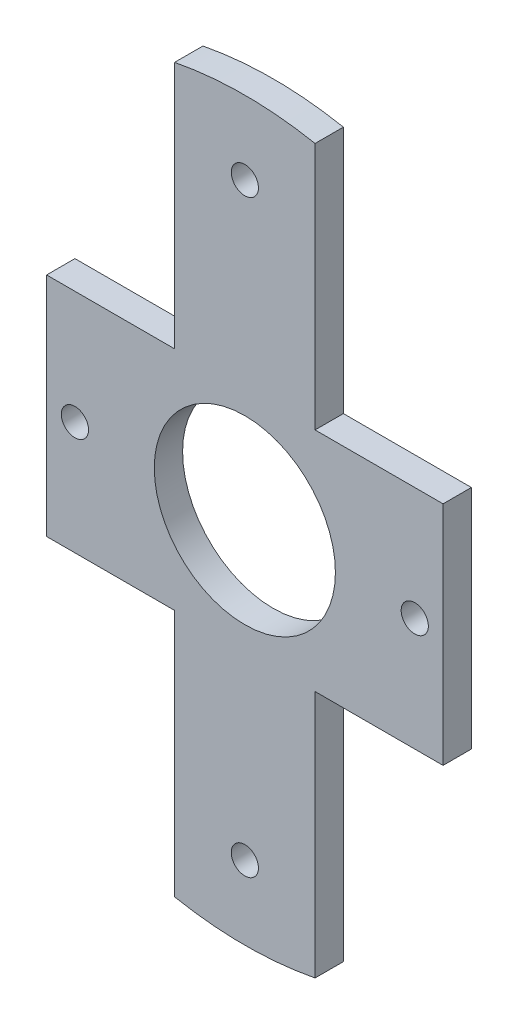
ISO-10303-21;
HEADER;
FILE_DESCRIPTION(('STEP AP214'),'2;1');
FILE_NAME('part.step','',(''),(''),'','','');
FILE_SCHEMA(('AUTOMOTIVE_DESIGN { 1 0 10303 214 1 1 1 1 }'));
ENDSEC;
DATA;
#1=APPLICATION_CONTEXT('core data for automotive mechanical design processes');
#2=APPLICATION_PROTOCOL_DEFINITION('international standard','automotive_design',2000,#1);
#3=PRODUCT_CONTEXT('',#1,'mechanical');
#4=PRODUCT('Part','Part','',(#3));
#5=PRODUCT_RELATED_PRODUCT_CATEGORY('part','',(#4));
#6=PRODUCT_DEFINITION_FORMATION('','',#4);
#7=PRODUCT_DEFINITION_CONTEXT('part definition',#1,'design');
#8=PRODUCT_DEFINITION('design','',#6,#7);
#9=PRODUCT_DEFINITION_SHAPE('','',#8);
#10=(LENGTH_UNIT() NAMED_UNIT(*) SI_UNIT(.MILLI.,.METRE.));
#11=(NAMED_UNIT(*) PLANE_ANGLE_UNIT() SI_UNIT($,.RADIAN.));
#12=(NAMED_UNIT(*) SI_UNIT($,.STERADIAN.) SOLID_ANGLE_UNIT());
#13=UNCERTAINTY_MEASURE_WITH_UNIT(LENGTH_MEASURE(1.E-05),#10,'distance_accuracy_value','');
#14=(GEOMETRIC_REPRESENTATION_CONTEXT(3) GLOBAL_UNCERTAINTY_ASSIGNED_CONTEXT((#13)) GLOBAL_UNIT_ASSIGNED_CONTEXT((#10,
#11,#12)) REPRESENTATION_CONTEXT('',''));
#15=CARTESIAN_POINT('',(0.,0.,0.));
#16=DIRECTION('',(0.,0.,1.));
#17=DIRECTION('',(1.,0.,0.));
#18=AXIS2_PLACEMENT_3D('',#15,#16,#17);
#19=CARTESIAN_POINT('',(0.,0.,5.));
#20=DIRECTION('',(0.,0.,1.));
#21=DIRECTION('',(1.,0.,0.));
#22=AXIS2_PLACEMENT_3D('',#19,#20,#21);
#23=PLANE('',#22);
#24=CARTESIAN_POINT('',(0.,-52.,5.));
#25=DIRECTION('',(0.,0.,1.));
#26=DIRECTION('',(-1.,0.,0.));
#27=AXIS2_PLACEMENT_3D('',#24,#25,#26);
#28=CIRCLE('',#27,2.4);
#29=CARTESIAN_POINT('',(-2.4,-52.,5.));
#30=VERTEX_POINT('',#29);
#31=EDGE_CURVE('E299',#30,#30,#28,.T.);
#32=ORIENTED_EDGE('',*,*,#31,.F.);
#33=EDGE_LOOP('',(#32));
#34=FACE_BOUND('',#33,.T.);
#35=CARTESIAN_POINT('',(0.,52.,5.));
#36=DIRECTION('',(0.,0.,1.));
#37=DIRECTION('',(1.,0.,0.));
#38=AXIS2_PLACEMENT_3D('',#35,#36,#37);
#39=CIRCLE('',#38,2.4);
#40=CARTESIAN_POINT('',(2.4,52.,5.));
#41=VERTEX_POINT('',#40);
#42=EDGE_CURVE('E311',#41,#41,#39,.T.);
#43=ORIENTED_EDGE('',*,*,#42,.F.);
#44=EDGE_LOOP('',(#43));
#45=FACE_BOUND('',#44,.T.);
#46=DIRECTION('',(0.,1.,0.));
#47=VECTOR('',#46,1.);
#48=CARTESIAN_POINT('',(12.4,20.,5.));
#49=LINE('',#48,#47);
#50=CARTESIAN_POINT('',(12.4,20.,5.));
#51=VERTEX_POINT('',#50);
#52=CARTESIAN_POINT('',(12.4,63.806269284452,5.));
#53=VERTEX_POINT('',#52);
#54=EDGE_CURVE('E181',#51,#53,#49,.T.);
#55=ORIENTED_EDGE('',*,*,#54,.T.);
#56=CARTESIAN_POINT('',(0.,0.,5.));
#57=DIRECTION('',(0.,0.,1.));
#58=DIRECTION('',(1.,0.,0.));
#59=AXIS2_PLACEMENT_3D('',#56,#57,#58);
#60=CIRCLE('',#59,65.);
#61=CARTESIAN_POINT('',(-12.4,63.806269284452,5.));
#62=VERTEX_POINT('',#61);
#63=EDGE_CURVE('E108',#53,#62,#60,.T.);
#64=ORIENTED_EDGE('',*,*,#63,.T.);
#65=DIRECTION('',(0.,-1.,0.));
#66=VECTOR('',#65,1.);
#67=CARTESIAN_POINT('',(-12.4,20.,5.));
#68=LINE('',#67,#66);
#69=CARTESIAN_POINT('',(-12.4,20.,5.));
#70=VERTEX_POINT('',#69);
#71=EDGE_CURVE('E208',#62,#70,#68,.T.);
#72=ORIENTED_EDGE('',*,*,#71,.T.);
#73=DIRECTION('',(-1.,0.,0.));
#74=VECTOR('',#73,1.);
#75=CARTESIAN_POINT('',(-12.4,20.,5.));
#76=LINE('',#75,#74);
#77=CARTESIAN_POINT('',(-35.,20.,5.));
#78=VERTEX_POINT('',#77);
#79=EDGE_CURVE('E227',#70,#78,#76,.T.);
#80=ORIENTED_EDGE('',*,*,#79,.T.);
#81=DIRECTION('',(0.,-1.,0.));
#82=VECTOR('',#81,1.);
#83=CARTESIAN_POINT('',(-35.,20.,5.));
#84=LINE('',#83,#82);
#85=CARTESIAN_POINT('',(-35.,-20.,5.));
#86=VERTEX_POINT('',#85);
#87=EDGE_CURVE('E224',#78,#86,#84,.T.);
#88=ORIENTED_EDGE('',*,*,#87,.T.);
#89=DIRECTION('',(1.,0.,0.));
#90=VECTOR('',#89,1.);
#91=CARTESIAN_POINT('',(-12.4,-20.,5.));
#92=LINE('',#91,#90);
#93=CARTESIAN_POINT('',(-12.4,-20.,5.));
#94=VERTEX_POINT('',#93);
#95=EDGE_CURVE('E226',#86,#94,#92,.T.);
#96=ORIENTED_EDGE('',*,*,#95,.T.);
#97=DIRECTION('',(0.,-1.,0.));
#98=VECTOR('',#97,1.);
#99=CARTESIAN_POINT('',(-12.4,-20.,5.));
#100=LINE('',#99,#98);
#101=CARTESIAN_POINT('',(-12.4,-63.806269284452,5.));
#102=VERTEX_POINT('',#101);
#103=EDGE_CURVE('E229',#94,#102,#100,.T.);
#104=ORIENTED_EDGE('',*,*,#103,.T.);
#105=CARTESIAN_POINT('',(0.,0.,5.));
#106=DIRECTION('',(0.,0.,1.));
#107=DIRECTION('',(1.,0.,0.));
#108=AXIS2_PLACEMENT_3D('',#105,#106,#107);
#109=CIRCLE('',#108,65.);
#110=CARTESIAN_POINT('',(12.4,-63.806269284452,5.));
#111=VERTEX_POINT('',#110);
#112=EDGE_CURVE('E235',#102,#111,#109,.T.);
#113=ORIENTED_EDGE('',*,*,#112,.T.);
#114=DIRECTION('',(0.,1.,0.));
#115=VECTOR('',#114,1.);
#116=CARTESIAN_POINT('',(12.4,-20.,5.));
#117=LINE('',#116,#115);
#118=CARTESIAN_POINT('',(12.4,-20.,5.));
#119=VERTEX_POINT('',#118);
#120=EDGE_CURVE('E139',#111,#119,#117,.T.);
#121=ORIENTED_EDGE('',*,*,#120,.T.);
#122=DIRECTION('',(1.,0.,0.));
#123=VECTOR('',#122,1.);
#124=CARTESIAN_POINT('',(12.4,-20.,5.));
#125=LINE('',#124,#123);
#126=CARTESIAN_POINT('',(35.,-20.,5.));
#127=VERTEX_POINT('',#126);
#128=EDGE_CURVE('E133',#119,#127,#125,.T.);
#129=ORIENTED_EDGE('',*,*,#128,.T.);
#130=DIRECTION('',(0.,1.,0.));
#131=VECTOR('',#130,1.);
#132=CARTESIAN_POINT('',(35.,-20.,5.));
#133=LINE('',#132,#131);
#134=CARTESIAN_POINT('',(35.,20.,5.));
#135=VERTEX_POINT('',#134);
#136=EDGE_CURVE('E137',#127,#135,#133,.T.);
#137=ORIENTED_EDGE('',*,*,#136,.T.);
#138=DIRECTION('',(-1.,0.,0.));
#139=VECTOR('',#138,1.);
#140=CARTESIAN_POINT('',(12.4,20.,5.));
#141=LINE('',#140,#139);
#142=EDGE_CURVE('E54',#135,#51,#141,.T.);
#143=ORIENTED_EDGE('',*,*,#142,.T.);
#144=EDGE_LOOP('',(#55,#64,#72,#80,#88,#96,#104,#113,#121,#129,#137,#143));
#145=FACE_BOUND('',#144,.T.);
#146=CARTESIAN_POINT('',(0.,0.,5.));
#147=DIRECTION('',(0.,0.,1.));
#148=DIRECTION('',(1.,0.,0.));
#149=AXIS2_PLACEMENT_3D('',#146,#147,#148);
#150=CIRCLE('',#149,15.99);
#151=CARTESIAN_POINT('',(15.99,0.,5.));
#152=VERTEX_POINT('',#151);
#153=EDGE_CURVE('E162',#152,#152,#150,.T.);
#154=ORIENTED_EDGE('',*,*,#153,.F.);
#155=EDGE_LOOP('',(#154));
#156=FACE_BOUND('',#155,.T.);
#157=CARTESIAN_POINT('',(30.,0.,5.));
#158=DIRECTION('',(0.,0.,1.));
#159=DIRECTION('',(1.,0.,0.));
#160=AXIS2_PLACEMENT_3D('',#157,#158,#159);
#161=CIRCLE('',#160,2.4);
#162=CARTESIAN_POINT('',(32.4,0.,5.));
#163=VERTEX_POINT('',#162);
#164=EDGE_CURVE('E305',#163,#163,#161,.T.);
#165=ORIENTED_EDGE('',*,*,#164,.F.);
#166=EDGE_LOOP('',(#165));
#167=FACE_BOUND('',#166,.T.);
#168=CARTESIAN_POINT('',(-30.,0.,5.));
#169=DIRECTION('',(0.,0.,1.));
#170=DIRECTION('',(-1.,0.,0.));
#171=AXIS2_PLACEMENT_3D('',#168,#169,#170);
#172=CIRCLE('',#171,2.4);
#173=CARTESIAN_POINT('',(-32.4,0.,5.));
#174=VERTEX_POINT('',#173);
#175=EDGE_CURVE('E290',#174,#174,#172,.T.);
#176=ORIENTED_EDGE('',*,*,#175,.F.);
#177=EDGE_LOOP('',(#176));
#178=FACE_BOUND('',#177,.T.);
#179=ADVANCED_FACE('F37',(#34,#45,#145,#156,#167,#178),#23,.T.);
#180=CARTESIAN_POINT('',(0.,0.,0.));
#181=DIRECTION('',(0.,0.,1.));
#182=DIRECTION('',(1.,0.,0.));
#183=AXIS2_PLACEMENT_3D('',#180,#181,#182);
#184=PLANE('',#183);
#185=DIRECTION('',(0.,1.,0.));
#186=VECTOR('',#185,1.);
#187=CARTESIAN_POINT('',(12.4,20.,0.));
#188=LINE('',#187,#186);
#189=CARTESIAN_POINT('',(12.4,20.,0.));
#190=VERTEX_POINT('',#189);
#191=CARTESIAN_POINT('',(12.4,63.806269284452,0.));
#192=VERTEX_POINT('',#191);
#193=EDGE_CURVE('E158',#190,#192,#188,.T.);
#194=ORIENTED_EDGE('',*,*,#193,.F.);
#195=DIRECTION('',(-1.,0.,0.));
#196=VECTOR('',#195,1.);
#197=CARTESIAN_POINT('',(12.4,20.,0.));
#198=LINE('',#197,#196);
#199=CARTESIAN_POINT('',(35.,20.,0.));
#200=VERTEX_POINT('',#199);
#201=EDGE_CURVE('E100',#200,#190,#198,.T.);
#202=ORIENTED_EDGE('',*,*,#201,.F.);
#203=DIRECTION('',(0.,1.,0.));
#204=VECTOR('',#203,1.);
#205=CARTESIAN_POINT('',(35.,20.,0.));
#206=LINE('',#205,#204);
#207=CARTESIAN_POINT('',(35.,-20.,0.));
#208=VERTEX_POINT('',#207);
#209=EDGE_CURVE('E94',#208,#200,#206,.T.);
#210=ORIENTED_EDGE('',*,*,#209,.F.);
#211=DIRECTION('',(1.,0.,0.));
#212=VECTOR('',#211,1.);
#213=CARTESIAN_POINT('',(12.4,-20.,0.));
#214=LINE('',#213,#212);
#215=CARTESIAN_POINT('',(12.4,-20.,0.));
#216=VERTEX_POINT('',#215);
#217=EDGE_CURVE('E148',#216,#208,#214,.T.);
#218=ORIENTED_EDGE('',*,*,#217,.F.);
#219=DIRECTION('',(0.,1.,0.));
#220=VECTOR('',#219,1.);
#221=CARTESIAN_POINT('',(12.4,-20.,0.));
#222=LINE('',#221,#220);
#223=CARTESIAN_POINT('',(12.4,-63.806269284452,0.));
#224=VERTEX_POINT('',#223);
#225=EDGE_CURVE('E176',#224,#216,#222,.T.);
#226=ORIENTED_EDGE('',*,*,#225,.F.);
#227=CARTESIAN_POINT('',(0.,0.,0.));
#228=DIRECTION('',(0.,0.,1.));
#229=DIRECTION('',(1.,0.,0.));
#230=AXIS2_PLACEMENT_3D('',#227,#228,#229);
#231=CIRCLE('',#230,65.);
#232=CARTESIAN_POINT('',(-12.4,-63.806269284452,0.));
#233=VERTEX_POINT('',#232);
#234=EDGE_CURVE('E174',#233,#224,#231,.T.);
#235=ORIENTED_EDGE('',*,*,#234,.F.);
#236=DIRECTION('',(0.,-1.,0.));
#237=VECTOR('',#236,1.);
#238=CARTESIAN_POINT('',(-12.4,-20.,0.));
#239=LINE('',#238,#237);
#240=CARTESIAN_POINT('',(-12.4,-20.,0.));
#241=VERTEX_POINT('',#240);
#242=EDGE_CURVE('E172',#241,#233,#239,.T.);
#243=ORIENTED_EDGE('',*,*,#242,.F.);
#244=DIRECTION('',(1.,0.,0.));
#245=VECTOR('',#244,1.);
#246=CARTESIAN_POINT('',(-12.4,-20.,0.));
#247=LINE('',#246,#245);
#248=CARTESIAN_POINT('',(-35.,-20.,0.));
#249=VERTEX_POINT('',#248);
#250=EDGE_CURVE('E170',#249,#241,#247,.T.);
#251=ORIENTED_EDGE('',*,*,#250,.F.);
#252=DIRECTION('',(0.,-1.,0.));
#253=VECTOR('',#252,1.);
#254=CARTESIAN_POINT('',(-35.,20.,0.));
#255=LINE('',#254,#253);
#256=CARTESIAN_POINT('',(-35.,20.,0.));
#257=VERTEX_POINT('',#256);
#258=EDGE_CURVE('E168',#257,#249,#255,.T.);
#259=ORIENTED_EDGE('',*,*,#258,.F.);
#260=DIRECTION('',(-1.,0.,0.));
#261=VECTOR('',#260,1.);
#262=CARTESIAN_POINT('',(-12.4,20.,0.));
#263=LINE('',#262,#261);
#264=CARTESIAN_POINT('',(-12.4,20.,0.));
#265=VERTEX_POINT('',#264);
#266=EDGE_CURVE('E166',#265,#257,#263,.T.);
#267=ORIENTED_EDGE('',*,*,#266,.F.);
#268=DIRECTION('',(0.,-1.,0.));
#269=VECTOR('',#268,1.);
#270=CARTESIAN_POINT('',(-12.4,20.,0.));
#271=LINE('',#270,#269);
#272=CARTESIAN_POINT('',(-12.4,63.806269284452,0.));
#273=VERTEX_POINT('',#272);
#274=EDGE_CURVE('E164',#273,#265,#271,.T.);
#275=ORIENTED_EDGE('',*,*,#274,.F.);
#276=CARTESIAN_POINT('',(0.,0.,0.));
#277=DIRECTION('',(0.,0.,1.));
#278=DIRECTION('',(1.,0.,0.));
#279=AXIS2_PLACEMENT_3D('',#276,#277,#278);
#280=CIRCLE('',#279,65.);
#281=EDGE_CURVE('E161',#192,#273,#280,.T.);
#282=ORIENTED_EDGE('',*,*,#281,.F.);
#283=EDGE_LOOP('',(#194,#202,#210,#218,#226,#235,#243,#251,#259,#267,#275,#282));
#284=FACE_BOUND('',#283,.T.);
#285=CARTESIAN_POINT('',(0.,0.,0.));
#286=DIRECTION('',(0.,0.,1.));
#287=DIRECTION('',(1.,0.,0.));
#288=AXIS2_PLACEMENT_3D('',#285,#286,#287);
#289=CIRCLE('',#288,15.99);
#290=CARTESIAN_POINT('',(15.99,0.,0.));
#291=VERTEX_POINT('',#290);
#292=EDGE_CURVE('E314',#291,#291,#289,.T.);
#293=ORIENTED_EDGE('',*,*,#292,.T.);
#294=EDGE_LOOP('',(#293));
#295=FACE_BOUND('',#294,.T.);
#296=CARTESIAN_POINT('',(0.,52.,0.));
#297=DIRECTION('',(0.,0.,1.));
#298=DIRECTION('',(1.,0.,0.));
#299=AXIS2_PLACEMENT_3D('',#296,#297,#298);
#300=CIRCLE('',#299,2.4);
#301=CARTESIAN_POINT('',(2.4,52.,0.));
#302=VERTEX_POINT('',#301);
#303=EDGE_CURVE('E308',#302,#302,#300,.T.);
#304=ORIENTED_EDGE('',*,*,#303,.T.);
#305=EDGE_LOOP('',(#304));
#306=FACE_BOUND('',#305,.T.);
#307=CARTESIAN_POINT('',(30.,0.,0.));
#308=DIRECTION('',(0.,0.,1.));
#309=DIRECTION('',(1.,0.,0.));
#310=AXIS2_PLACEMENT_3D('',#307,#308,#309);
#311=CIRCLE('',#310,2.4);
#312=CARTESIAN_POINT('',(32.4,0.,0.));
#313=VERTEX_POINT('',#312);
#314=EDGE_CURVE('E302',#313,#313,#311,.T.);
#315=ORIENTED_EDGE('',*,*,#314,.T.);
#316=EDGE_LOOP('',(#315));
#317=FACE_BOUND('',#316,.T.);
#318=CARTESIAN_POINT('',(0.,-52.,0.));
#319=DIRECTION('',(0.,0.,1.));
#320=DIRECTION('',(-1.,0.,0.));
#321=AXIS2_PLACEMENT_3D('',#318,#319,#320);
#322=CIRCLE('',#321,2.4);
#323=CARTESIAN_POINT('',(-2.4,-52.,0.));
#324=VERTEX_POINT('',#323);
#325=EDGE_CURVE('E296',#324,#324,#322,.T.);
#326=ORIENTED_EDGE('',*,*,#325,.T.);
#327=EDGE_LOOP('',(#326));
#328=FACE_BOUND('',#327,.T.);
#329=CARTESIAN_POINT('',(-30.,0.,0.));
#330=DIRECTION('',(0.,0.,1.));
#331=DIRECTION('',(-1.,0.,0.));
#332=AXIS2_PLACEMENT_3D('',#329,#330,#331);
#333=CIRCLE('',#332,2.4);
#334=CARTESIAN_POINT('',(-32.4,0.,0.));
#335=VERTEX_POINT('',#334);
#336=EDGE_CURVE('E293',#335,#335,#333,.T.);
#337=ORIENTED_EDGE('',*,*,#336,.T.);
#338=EDGE_LOOP('',(#337));
#339=FACE_BOUND('',#338,.T.);
#340=ADVANCED_FACE('F212',(#284,#295,#306,#317,#328,#339),#184,.F.);
#341=CARTESIAN_POINT('',(12.4,20.,5.));
#342=DIRECTION('',(-1.,0.,0.));
#343=DIRECTION('',(0.,0.,1.));
#344=AXIS2_PLACEMENT_3D('',#341,#342,#343);
#345=PLANE('',#344);
#346=ORIENTED_EDGE('',*,*,#193,.T.);
#347=DIRECTION('',(0.,0.,-1.));
#348=VECTOR('',#347,1.);
#349=CARTESIAN_POINT('',(12.4,63.806269284452,5.));
#350=LINE('',#349,#348);
#351=EDGE_CURVE('E11',#53,#192,#350,.T.);
#352=ORIENTED_EDGE('',*,*,#351,.F.);
#353=ORIENTED_EDGE('',*,*,#54,.F.);
#354=DIRECTION('',(0.,0.,-1.));
#355=VECTOR('',#354,1.);
#356=CARTESIAN_POINT('',(12.4,20.,5.));
#357=LINE('',#356,#355);
#358=EDGE_CURVE('E154',#51,#190,#357,.T.);
#359=ORIENTED_EDGE('',*,*,#358,.T.);
#360=EDGE_LOOP('',(#346,#352,#353,#359));
#361=FACE_BOUND('',#360,.T.);
#362=ADVANCED_FACE('F39',(#361),#345,.F.);
#363=CARTESIAN_POINT('',(0.,0.,5.));
#364=DIRECTION('',(0.,0.,-1.));
#365=DIRECTION('',(-1.,0.,0.));
#366=AXIS2_PLACEMENT_3D('',#363,#364,#365);
#367=CYLINDRICAL_SURFACE('',#366,65.);
#368=ORIENTED_EDGE('',*,*,#281,.T.);
#369=DIRECTION('',(0.,0.,-1.));
#370=VECTOR('',#369,1.);
#371=CARTESIAN_POINT('',(-12.4,63.806269284452,5.));
#372=LINE('',#371,#370);
#373=EDGE_CURVE('E46',#62,#273,#372,.T.);
#374=ORIENTED_EDGE('',*,*,#373,.F.);
#375=ORIENTED_EDGE('',*,*,#63,.F.);
#376=ORIENTED_EDGE('',*,*,#351,.T.);
#377=EDGE_LOOP('',(#368,#374,#375,#376));
#378=FACE_BOUND('',#377,.T.);
#379=ADVANCED_FACE('F443',(#378),#367,.T.);
#380=CARTESIAN_POINT('',(-12.4,20.,5.));
#381=DIRECTION('',(1.,0.,0.));
#382=DIRECTION('',(0.,0.,-1.));
#383=AXIS2_PLACEMENT_3D('',#380,#381,#382);
#384=PLANE('',#383);
#385=ORIENTED_EDGE('',*,*,#274,.T.);
#386=DIRECTION('',(0.,0.,-1.));
#387=VECTOR('',#386,1.);
#388=CARTESIAN_POINT('',(-12.4,20.,5.));
#389=LINE('',#388,#387);
#390=EDGE_CURVE('E200',#70,#265,#389,.T.);
#391=ORIENTED_EDGE('',*,*,#390,.F.);
#392=ORIENTED_EDGE('',*,*,#71,.F.);
#393=ORIENTED_EDGE('',*,*,#373,.T.);
#394=EDGE_LOOP('',(#385,#391,#392,#393));
#395=FACE_BOUND('',#394,.T.);
#396=ADVANCED_FACE('F206',(#395),#384,.F.);
#397=CARTESIAN_POINT('',(-12.4,20.,5.));
#398=DIRECTION('',(0.,-1.,0.));
#399=DIRECTION('',(0.,0.,-1.));
#400=AXIS2_PLACEMENT_3D('',#397,#398,#399);
#401=PLANE('',#400);
#402=ORIENTED_EDGE('',*,*,#266,.T.);
#403=DIRECTION('',(0.,0.,-1.));
#404=VECTOR('',#403,1.);
#405=CARTESIAN_POINT('',(-35.,20.,5.));
#406=LINE('',#405,#404);
#407=EDGE_CURVE('E197',#78,#257,#406,.T.);
#408=ORIENTED_EDGE('',*,*,#407,.F.);
#409=ORIENTED_EDGE('',*,*,#79,.F.);
#410=ORIENTED_EDGE('',*,*,#390,.T.);
#411=EDGE_LOOP('',(#402,#408,#409,#410));
#412=FACE_BOUND('',#411,.T.);
#413=ADVANCED_FACE('F218',(#412),#401,.F.);
#414=CARTESIAN_POINT('',(-35.,20.,5.));
#415=DIRECTION('',(1.,0.,0.));
#416=DIRECTION('',(0.,0.,-1.));
#417=AXIS2_PLACEMENT_3D('',#414,#415,#416);
#418=PLANE('',#417);
#419=ORIENTED_EDGE('',*,*,#258,.T.);
#420=DIRECTION('',(0.,0.,-1.));
#421=VECTOR('',#420,1.);
#422=CARTESIAN_POINT('',(-35.,-20.,5.));
#423=LINE('',#422,#421);
#424=EDGE_CURVE('E194',#86,#249,#423,.T.);
#425=ORIENTED_EDGE('',*,*,#424,.F.);
#426=ORIENTED_EDGE('',*,*,#87,.F.);
#427=ORIENTED_EDGE('',*,*,#407,.T.);
#428=EDGE_LOOP('',(#419,#425,#426,#427));
#429=FACE_BOUND('',#428,.T.);
#430=ADVANCED_FACE('F222',(#429),#418,.F.);
#431=CARTESIAN_POINT('',(-12.4,-20.,5.));
#432=DIRECTION('',(0.,1.,0.));
#433=DIRECTION('',(0.,0.,1.));
#434=AXIS2_PLACEMENT_3D('',#431,#432,#433);
#435=PLANE('',#434);
#436=ORIENTED_EDGE('',*,*,#250,.T.);
#437=DIRECTION('',(0.,0.,-1.));
#438=VECTOR('',#437,1.);
#439=CARTESIAN_POINT('',(-12.4,-20.,5.));
#440=LINE('',#439,#438);
#441=EDGE_CURVE('E191',#94,#241,#440,.T.);
#442=ORIENTED_EDGE('',*,*,#441,.F.);
#443=ORIENTED_EDGE('',*,*,#95,.F.);
#444=ORIENTED_EDGE('',*,*,#424,.T.);
#445=EDGE_LOOP('',(#436,#442,#443,#444));
#446=FACE_BOUND('',#445,.T.);
#447=ADVANCED_FACE('F404',(#446),#435,.F.);
#448=CARTESIAN_POINT('',(-12.4,-20.,5.));
#449=DIRECTION('',(1.,0.,0.));
#450=DIRECTION('',(0.,0.,-1.));
#451=AXIS2_PLACEMENT_3D('',#448,#449,#450);
#452=PLANE('',#451);
#453=ORIENTED_EDGE('',*,*,#242,.T.);
#454=DIRECTION('',(0.,0.,-1.));
#455=VECTOR('',#454,1.);
#456=CARTESIAN_POINT('',(-12.4,-63.806269284452,5.));
#457=LINE('',#456,#455);
#458=EDGE_CURVE('E188',#102,#233,#457,.T.);
#459=ORIENTED_EDGE('',*,*,#458,.F.);
#460=ORIENTED_EDGE('',*,*,#103,.F.);
#461=ORIENTED_EDGE('',*,*,#441,.T.);
#462=EDGE_LOOP('',(#453,#459,#460,#461));
#463=FACE_BOUND('',#462,.T.);
#464=ADVANCED_FACE('F394',(#463),#452,.F.);
#465=CARTESIAN_POINT('',(0.,0.,5.));
#466=DIRECTION('',(0.,0.,-1.));
#467=DIRECTION('',(-1.,0.,0.));
#468=AXIS2_PLACEMENT_3D('',#465,#466,#467);
#469=CYLINDRICAL_SURFACE('',#468,65.);
#470=ORIENTED_EDGE('',*,*,#234,.T.);
#471=DIRECTION('',(0.,0.,-1.));
#472=VECTOR('',#471,1.);
#473=CARTESIAN_POINT('',(12.4,-63.806269284452,5.));
#474=LINE('',#473,#472);
#475=EDGE_CURVE('E185',#111,#224,#474,.T.);
#476=ORIENTED_EDGE('',*,*,#475,.F.);
#477=ORIENTED_EDGE('',*,*,#112,.F.);
#478=ORIENTED_EDGE('',*,*,#458,.T.);
#479=EDGE_LOOP('',(#470,#476,#477,#478));
#480=FACE_BOUND('',#479,.T.);
#481=ADVANCED_FACE('F241',(#480),#469,.T.);
#482=CARTESIAN_POINT('',(12.4,-20.,5.));
#483=DIRECTION('',(-1.,0.,0.));
#484=DIRECTION('',(0.,0.,1.));
#485=AXIS2_PLACEMENT_3D('',#482,#483,#484);
#486=PLANE('',#485);
#487=ORIENTED_EDGE('',*,*,#225,.T.);
#488=DIRECTION('',(0.,0.,-1.));
#489=VECTOR('',#488,1.);
#490=CARTESIAN_POINT('',(12.4,-20.,5.));
#491=LINE('',#490,#489);
#492=EDGE_CURVE('E149',#119,#216,#491,.T.);
#493=ORIENTED_EDGE('',*,*,#492,.F.);
#494=ORIENTED_EDGE('',*,*,#120,.F.);
#495=ORIENTED_EDGE('',*,*,#475,.T.);
#496=EDGE_LOOP('',(#487,#493,#494,#495));
#497=FACE_BOUND('',#496,.T.);
#498=ADVANCED_FACE('F245',(#497),#486,.F.);
#499=CARTESIAN_POINT('',(12.4,-20.,5.));
#500=DIRECTION('',(0.,1.,0.));
#501=DIRECTION('',(0.,0.,1.));
#502=AXIS2_PLACEMENT_3D('',#499,#500,#501);
#503=PLANE('',#502);
#504=ORIENTED_EDGE('',*,*,#217,.T.);
#505=DIRECTION('',(0.,0.,-1.));
#506=VECTOR('',#505,1.);
#507=CARTESIAN_POINT('',(35.,-20.,5.));
#508=LINE('',#507,#506);
#509=EDGE_CURVE('E145',#127,#208,#508,.T.);
#510=ORIENTED_EDGE('',*,*,#509,.F.);
#511=ORIENTED_EDGE('',*,*,#128,.F.);
#512=ORIENTED_EDGE('',*,*,#492,.T.);
#513=EDGE_LOOP('',(#504,#510,#511,#512));
#514=FACE_BOUND('',#513,.T.);
#515=ADVANCED_FACE('F146',(#514),#503,.F.);
#516=CARTESIAN_POINT('',(35.,20.,5.));
#517=DIRECTION('',(-1.,0.,0.));
#518=DIRECTION('',(0.,-1.,0.));
#519=AXIS2_PLACEMENT_3D('',#516,#517,#518);
#520=PLANE('',#519);
#521=ORIENTED_EDGE('',*,*,#209,.T.);
#522=DIRECTION('',(0.,0.,-1.));
#523=VECTOR('',#522,1.);
#524=CARTESIAN_POINT('',(35.,20.,5.));
#525=LINE('',#524,#523);
#526=EDGE_CURVE('E150',#135,#200,#525,.T.);
#527=ORIENTED_EDGE('',*,*,#526,.F.);
#528=ORIENTED_EDGE('',*,*,#136,.F.);
#529=ORIENTED_EDGE('',*,*,#509,.T.);
#530=EDGE_LOOP('',(#521,#527,#528,#529));
#531=FACE_BOUND('',#530,.T.);
#532=ADVANCED_FACE('F152',(#531),#520,.F.);
#533=CARTESIAN_POINT('',(12.4,20.,5.));
#534=DIRECTION('',(0.,-1.,0.));
#535=DIRECTION('',(0.,0.,-1.));
#536=AXIS2_PLACEMENT_3D('',#533,#534,#535);
#537=PLANE('',#536);
#538=ORIENTED_EDGE('',*,*,#201,.T.);
#539=ORIENTED_EDGE('',*,*,#358,.F.);
#540=ORIENTED_EDGE('',*,*,#142,.F.);
#541=ORIENTED_EDGE('',*,*,#526,.T.);
#542=EDGE_LOOP('',(#538,#539,#540,#541));
#543=FACE_BOUND('',#542,.T.);
#544=ADVANCED_FACE('F249',(#543),#537,.F.);
#545=CARTESIAN_POINT('',(0.,0.,5.));
#546=DIRECTION('',(0.,0.,-1.));
#547=DIRECTION('',(-1.,0.,0.));
#548=AXIS2_PLACEMENT_3D('',#545,#546,#547);
#549=CYLINDRICAL_SURFACE('',#548,15.99);
#550=ORIENTED_EDGE('',*,*,#153,.T.);
#551=EDGE_LOOP('',(#550));
#552=FACE_BOUND('',#551,.T.);
#553=ORIENTED_EDGE('',*,*,#292,.F.);
#554=EDGE_LOOP('',(#553));
#555=FACE_BOUND('',#554,.T.);
#556=ADVANCED_FACE('F251',(#552,#555),#549,.F.);
#557=CARTESIAN_POINT('',(0.,52.,5.));
#558=DIRECTION('',(0.,0.,-1.));
#559=DIRECTION('',(-1.,0.,0.));
#560=AXIS2_PLACEMENT_3D('',#557,#558,#559);
#561=CYLINDRICAL_SURFACE('',#560,2.4);
#562=ORIENTED_EDGE('',*,*,#42,.T.);
#563=EDGE_LOOP('',(#562));
#564=FACE_BOUND('',#563,.T.);
#565=ORIENTED_EDGE('',*,*,#303,.F.);
#566=EDGE_LOOP('',(#565));
#567=FACE_BOUND('',#566,.T.);
#568=ADVANCED_FACE('F257',(#564,#567),#561,.F.);
#569=CARTESIAN_POINT('',(30.,0.,5.));
#570=DIRECTION('',(0.,0.,-1.));
#571=DIRECTION('',(-1.,0.,0.));
#572=AXIS2_PLACEMENT_3D('',#569,#570,#571);
#573=CYLINDRICAL_SURFACE('',#572,2.4);
#574=ORIENTED_EDGE('',*,*,#164,.T.);
#575=EDGE_LOOP('',(#574));
#576=FACE_BOUND('',#575,.T.);
#577=ORIENTED_EDGE('',*,*,#314,.F.);
#578=EDGE_LOOP('',(#577));
#579=FACE_BOUND('',#578,.T.);
#580=ADVANCED_FACE('F273',(#576,#579),#573,.F.);
#581=CARTESIAN_POINT('',(0.,-52.,5.));
#582=DIRECTION('',(0.,0.,-1.));
#583=DIRECTION('',(-1.,0.,0.));
#584=AXIS2_PLACEMENT_3D('',#581,#582,#583);
#585=CYLINDRICAL_SURFACE('',#584,2.4);
#586=ORIENTED_EDGE('',*,*,#31,.T.);
#587=EDGE_LOOP('',(#586));
#588=FACE_BOUND('',#587,.T.);
#589=ORIENTED_EDGE('',*,*,#325,.F.);
#590=EDGE_LOOP('',(#589));
#591=FACE_BOUND('',#590,.T.);
#592=ADVANCED_FACE('F277',(#588,#591),#585,.F.);
#593=CARTESIAN_POINT('',(-30.,0.,5.));
#594=DIRECTION('',(0.,0.,-1.));
#595=DIRECTION('',(-1.,0.,0.));
#596=AXIS2_PLACEMENT_3D('',#593,#594,#595);
#597=CYLINDRICAL_SURFACE('',#596,2.4);
#598=ORIENTED_EDGE('',*,*,#175,.T.);
#599=EDGE_LOOP('',(#598));
#600=FACE_BOUND('',#599,.T.);
#601=ORIENTED_EDGE('',*,*,#336,.F.);
#602=EDGE_LOOP('',(#601));
#603=FACE_BOUND('',#602,.T.);
#604=ADVANCED_FACE('F281',(#600,#603),#597,.F.);
#605=CLOSED_SHELL('',(#179,#340,#362,#379,#396,#413,#430,#447,#464,#481,#498,#515,#532,#544,
#556,#568,#580,#592,#604));
#606=MANIFOLD_SOLID_BREP('B2',#605);
#607=ADVANCED_BREP_SHAPE_REPRESENTATION('',(#18,#606),#14);
#608=SHAPE_DEFINITION_REPRESENTATION(#9,#607);
ENDSEC;
END-ISO-10303-21;
